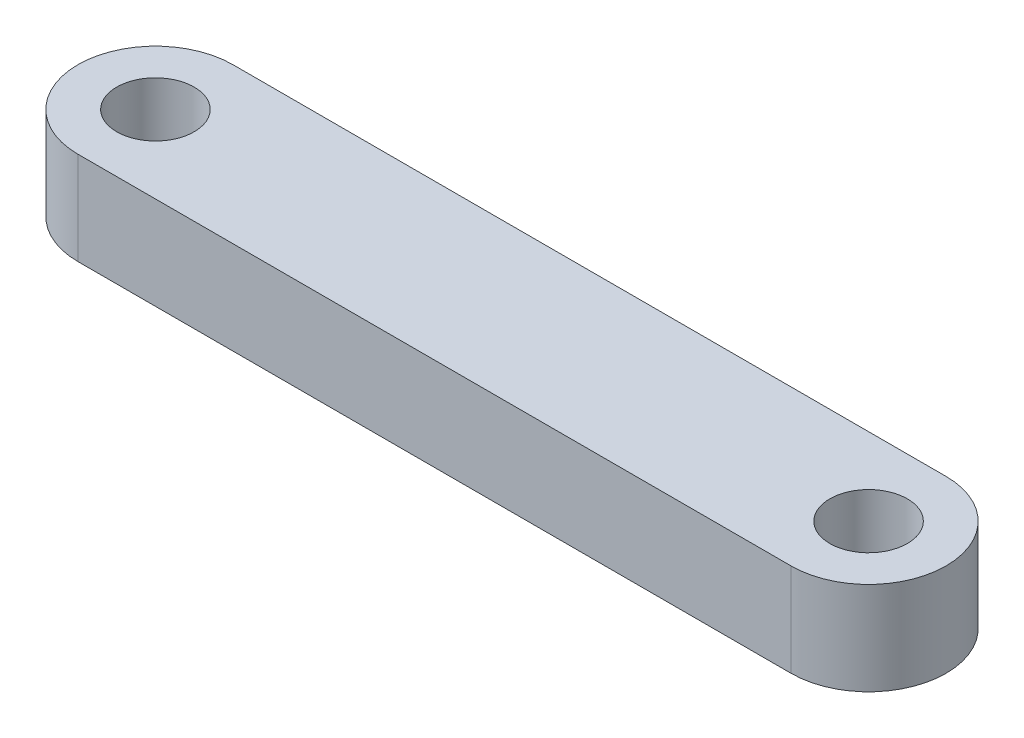
ISO-10303-21;
HEADER;
FILE_DESCRIPTION(('STEP AP214'),'2;1');
FILE_NAME('part.step','',(''),(''),'','','');
FILE_SCHEMA(('AUTOMOTIVE_DESIGN { 1 0 10303 214 1 1 1 1 }'));
ENDSEC;
DATA;
#1=APPLICATION_CONTEXT('core data for automotive mechanical design processes');
#2=APPLICATION_PROTOCOL_DEFINITION('international standard','automotive_design',2000,#1);
#3=PRODUCT_CONTEXT('',#1,'mechanical');
#4=PRODUCT('Part','Part','',(#3));
#5=PRODUCT_RELATED_PRODUCT_CATEGORY('part','',(#4));
#6=PRODUCT_DEFINITION_FORMATION('','',#4);
#7=PRODUCT_DEFINITION_CONTEXT('part definition',#1,'design');
#8=PRODUCT_DEFINITION('design','',#6,#7);
#9=PRODUCT_DEFINITION_SHAPE('','',#8);
#10=(LENGTH_UNIT() NAMED_UNIT(*) SI_UNIT(.MILLI.,.METRE.));
#11=(NAMED_UNIT(*) PLANE_ANGLE_UNIT() SI_UNIT($,.RADIAN.));
#12=(NAMED_UNIT(*) SI_UNIT($,.STERADIAN.) SOLID_ANGLE_UNIT());
#13=UNCERTAINTY_MEASURE_WITH_UNIT(LENGTH_MEASURE(1.E-05),#10,'distance_accuracy_value','');
#14=(GEOMETRIC_REPRESENTATION_CONTEXT(3) GLOBAL_UNCERTAINTY_ASSIGNED_CONTEXT((#13)) GLOBAL_UNIT_ASSIGNED_CONTEXT((#10,
#11,#12)) REPRESENTATION_CONTEXT('',''));
#15=CARTESIAN_POINT('',(0.,0.,0.));
#16=DIRECTION('',(0.,0.,1.));
#17=DIRECTION('',(1.,0.,0.));
#18=AXIS2_PLACEMENT_3D('',#15,#16,#17);
#19=CARTESIAN_POINT('',(11.5,3.,0.));
#20=DIRECTION('',(0.,-1.,0.));
#21=DIRECTION('',(0.,0.,-1.));
#22=AXIS2_PLACEMENT_3D('',#19,#20,#21);
#23=CYLINDRICAL_SURFACE('',#22,2.5);
#24=CARTESIAN_POINT('',(11.5,0.,0.));
#25=DIRECTION('',(0.,1.,0.));
#26=DIRECTION('',(0.,0.,1.));
#27=AXIS2_PLACEMENT_3D('',#24,#25,#26);
#28=CIRCLE('',#27,2.5);
#29=CARTESIAN_POINT('',(11.5,0.,2.49999999999999));
#30=VERTEX_POINT('',#29);
#31=CARTESIAN_POINT('',(11.5,0.,-2.50000000000001));
#32=VERTEX_POINT('',#31);
#33=EDGE_CURVE('E107',#30,#32,#28,.T.);
#34=ORIENTED_EDGE('',*,*,#33,.T.);
#35=DIRECTION('',(0.,-1.,0.));
#36=VECTOR('',#35,1.);
#37=CARTESIAN_POINT('',(11.5,3.,-2.50000000000001));
#38=LINE('',#37,#36);
#39=CARTESIAN_POINT('',(11.5,3.,-2.50000000000001));
#40=VERTEX_POINT('',#39);
#41=EDGE_CURVE('E11',#40,#32,#38,.T.);
#42=ORIENTED_EDGE('',*,*,#41,.F.);
#43=CARTESIAN_POINT('',(11.5,3.,0.));
#44=DIRECTION('',(0.,1.,0.));
#45=DIRECTION('',(0.,0.,1.));
#46=AXIS2_PLACEMENT_3D('',#43,#44,#45);
#47=CIRCLE('',#46,2.5);
#48=CARTESIAN_POINT('',(11.5,3.,2.49999999999999));
#49=VERTEX_POINT('',#48);
#50=EDGE_CURVE('E91',#49,#40,#47,.T.);
#51=ORIENTED_EDGE('',*,*,#50,.F.);
#52=DIRECTION('',(0.,-1.,0.));
#53=VECTOR('',#52,1.);
#54=CARTESIAN_POINT('',(11.5,3.,2.49999999999999));
#55=LINE('',#54,#53);
#56=EDGE_CURVE('E103',#49,#30,#55,.T.);
#57=ORIENTED_EDGE('',*,*,#56,.T.);
#58=EDGE_LOOP('',(#34,#42,#51,#57));
#59=FACE_BOUND('',#58,.T.);
#60=ADVANCED_FACE('F39',(#59),#23,.T.);
#61=CARTESIAN_POINT('',(11.5,3.,-2.50000000000001));
#62=DIRECTION('',(0.,0.,1.));
#63=DIRECTION('',(1.,0.,0.));
#64=AXIS2_PLACEMENT_3D('',#61,#62,#63);
#65=PLANE('',#64);
#66=DIRECTION('',(-1.,0.,0.));
#67=VECTOR('',#66,1.);
#68=CARTESIAN_POINT('',(11.5,0.,-2.50000000000001));
#69=LINE('',#68,#67);
#70=CARTESIAN_POINT('',(-11.5,0.,-2.5));
#71=VERTEX_POINT('',#70);
#72=EDGE_CURVE('E96',#32,#71,#69,.T.);
#73=ORIENTED_EDGE('',*,*,#72,.T.);
#74=DIRECTION('',(0.,-1.,0.));
#75=VECTOR('',#74,1.);
#76=CARTESIAN_POINT('',(-11.5,3.,-2.5));
#77=LINE('',#76,#75);
#78=CARTESIAN_POINT('',(-11.5,3.,-2.5));
#79=VERTEX_POINT('',#78);
#80=EDGE_CURVE('E48',#79,#71,#77,.T.);
#81=ORIENTED_EDGE('',*,*,#80,.F.);
#82=DIRECTION('',(-1.,0.,0.));
#83=VECTOR('',#82,1.);
#84=CARTESIAN_POINT('',(11.5,3.,-2.50000000000001));
#85=LINE('',#84,#83);
#86=EDGE_CURVE('E86',#40,#79,#85,.T.);
#87=ORIENTED_EDGE('',*,*,#86,.F.);
#88=ORIENTED_EDGE('',*,*,#41,.T.);
#89=EDGE_LOOP('',(#73,#81,#87,#88));
#90=FACE_BOUND('',#89,.T.);
#91=ADVANCED_FACE('F95',(#90),#65,.F.);
#92=CARTESIAN_POINT('',(-11.5,3.,0.));
#93=DIRECTION('',(0.,-1.,0.));
#94=DIRECTION('',(0.,0.,-1.));
#95=AXIS2_PLACEMENT_3D('',#92,#93,#94);
#96=CYLINDRICAL_SURFACE('',#95,2.5);
#97=CARTESIAN_POINT('',(-11.5,0.,0.));
#98=DIRECTION('',(0.,1.,0.));
#99=DIRECTION('',(0.,0.,1.));
#100=AXIS2_PLACEMENT_3D('',#97,#98,#99);
#101=CIRCLE('',#100,2.5);
#102=CARTESIAN_POINT('',(-11.5,0.,2.5));
#103=VERTEX_POINT('',#102);
#104=EDGE_CURVE('E73',#71,#103,#101,.T.);
#105=ORIENTED_EDGE('',*,*,#104,.T.);
#106=DIRECTION('',(0.,-1.,0.));
#107=VECTOR('',#106,1.);
#108=CARTESIAN_POINT('',(-11.5,3.,2.5));
#109=LINE('',#108,#107);
#110=CARTESIAN_POINT('',(-11.5,3.,2.5));
#111=VERTEX_POINT('',#110);
#112=EDGE_CURVE('E98',#111,#103,#109,.T.);
#113=ORIENTED_EDGE('',*,*,#112,.F.);
#114=CARTESIAN_POINT('',(-11.5,3.,0.));
#115=DIRECTION('',(0.,1.,0.));
#116=DIRECTION('',(0.,0.,1.));
#117=AXIS2_PLACEMENT_3D('',#114,#115,#116);
#118=CIRCLE('',#117,2.5);
#119=EDGE_CURVE('E89',#79,#111,#118,.T.);
#120=ORIENTED_EDGE('',*,*,#119,.F.);
#121=ORIENTED_EDGE('',*,*,#80,.T.);
#122=EDGE_LOOP('',(#105,#113,#120,#121));
#123=FACE_BOUND('',#122,.T.);
#124=ADVANCED_FACE('F99',(#123),#96,.T.);
#125=CARTESIAN_POINT('',(11.5,3.,2.49999999999999));
#126=DIRECTION('',(0.,0.,-1.));
#127=DIRECTION('',(-1.,0.,0.));
#128=AXIS2_PLACEMENT_3D('',#125,#126,#127);
#129=PLANE('',#128);
#130=DIRECTION('',(1.,0.,0.));
#131=VECTOR('',#130,1.);
#132=CARTESIAN_POINT('',(11.5,0.,2.49999999999999));
#133=LINE('',#132,#131);
#134=EDGE_CURVE('E79',#103,#30,#133,.T.);
#135=ORIENTED_EDGE('',*,*,#134,.T.);
#136=ORIENTED_EDGE('',*,*,#56,.F.);
#137=DIRECTION('',(1.,0.,0.));
#138=VECTOR('',#137,1.);
#139=CARTESIAN_POINT('',(11.5,3.,2.49999999999999));
#140=LINE('',#139,#138);
#141=EDGE_CURVE('E56',#111,#49,#140,.T.);
#142=ORIENTED_EDGE('',*,*,#141,.F.);
#143=ORIENTED_EDGE('',*,*,#112,.T.);
#144=EDGE_LOOP('',(#135,#136,#142,#143));
#145=FACE_BOUND('',#144,.T.);
#146=ADVANCED_FACE('F121',(#145),#129,.F.);
#147=CARTESIAN_POINT('',(11.5,3.,0.));
#148=DIRECTION('',(0.,1.,0.));
#149=DIRECTION('',(0.,0.,1.));
#150=AXIS2_PLACEMENT_3D('',#147,#148,#149);
#151=PLANE('',#150);
#152=CARTESIAN_POINT('',(-11.5,3.,0.));
#153=DIRECTION('',(0.,1.,0.));
#154=DIRECTION('',(0.,0.,1.));
#155=AXIS2_PLACEMENT_3D('',#152,#153,#154);
#156=CIRCLE('',#155,1.25);
#157=CARTESIAN_POINT('',(-11.5,3.,1.25));
#158=VERTEX_POINT('',#157);
#159=EDGE_CURVE('E136',#158,#158,#156,.T.);
#160=ORIENTED_EDGE('',*,*,#159,.F.);
#161=EDGE_LOOP('',(#160));
#162=FACE_BOUND('',#161,.T.);
#163=CARTESIAN_POINT('',(11.5,3.,0.));
#164=DIRECTION('',(0.,1.,0.));
#165=DIRECTION('',(0.,0.,1.));
#166=AXIS2_PLACEMENT_3D('',#163,#164,#165);
#167=CIRCLE('',#166,1.25);
#168=CARTESIAN_POINT('',(11.5,3.,1.25));
#169=VERTEX_POINT('',#168);
#170=EDGE_CURVE('E128',#169,#169,#167,.T.);
#171=ORIENTED_EDGE('',*,*,#170,.F.);
#172=EDGE_LOOP('',(#171));
#173=FACE_BOUND('',#172,.T.);
#174=ORIENTED_EDGE('',*,*,#50,.T.);
#175=ORIENTED_EDGE('',*,*,#86,.T.);
#176=ORIENTED_EDGE('',*,*,#119,.T.);
#177=ORIENTED_EDGE('',*,*,#141,.T.);
#178=EDGE_LOOP('',(#174,#175,#176,#177));
#179=FACE_BOUND('',#178,.T.);
#180=ADVANCED_FACE('F87',(#162,#173,#179),#151,.T.);
#181=CARTESIAN_POINT('',(11.5,0.,0.));
#182=DIRECTION('',(0.,1.,0.));
#183=DIRECTION('',(0.,0.,1.));
#184=AXIS2_PLACEMENT_3D('',#181,#182,#183);
#185=PLANE('',#184);
#186=CARTESIAN_POINT('',(-11.5,0.,0.));
#187=DIRECTION('',(0.,1.,0.));
#188=DIRECTION('',(0.,0.,1.));
#189=AXIS2_PLACEMENT_3D('',#186,#187,#188);
#190=CIRCLE('',#189,1.25);
#191=CARTESIAN_POINT('',(-11.5,0.,1.25));
#192=VERTEX_POINT('',#191);
#193=EDGE_CURVE('E132',#192,#192,#190,.T.);
#194=ORIENTED_EDGE('',*,*,#193,.T.);
#195=EDGE_LOOP('',(#194));
#196=FACE_BOUND('',#195,.T.);
#197=CARTESIAN_POINT('',(11.5,0.,0.));
#198=DIRECTION('',(0.,1.,0.));
#199=DIRECTION('',(0.,0.,1.));
#200=AXIS2_PLACEMENT_3D('',#197,#198,#199);
#201=CIRCLE('',#200,1.25);
#202=CARTESIAN_POINT('',(11.5,0.,1.25));
#203=VERTEX_POINT('',#202);
#204=EDGE_CURVE('E111',#203,#203,#201,.T.);
#205=ORIENTED_EDGE('',*,*,#204,.T.);
#206=EDGE_LOOP('',(#205));
#207=FACE_BOUND('',#206,.T.);
#208=ORIENTED_EDGE('',*,*,#33,.F.);
#209=ORIENTED_EDGE('',*,*,#134,.F.);
#210=ORIENTED_EDGE('',*,*,#104,.F.);
#211=ORIENTED_EDGE('',*,*,#72,.F.);
#212=EDGE_LOOP('',(#208,#209,#210,#211));
#213=FACE_BOUND('',#212,.T.);
#214=ADVANCED_FACE('F124',(#196,#207,#213),#185,.F.);
#215=CARTESIAN_POINT('',(11.5,0.,0.));
#216=DIRECTION('',(0.,1.,0.));
#217=DIRECTION('',(0.,0.,1.));
#218=AXIS2_PLACEMENT_3D('',#215,#216,#217);
#219=CYLINDRICAL_SURFACE('',#218,1.25);
#220=ORIENTED_EDGE('',*,*,#204,.F.);
#221=EDGE_LOOP('',(#220));
#222=FACE_BOUND('',#221,.T.);
#223=ORIENTED_EDGE('',*,*,#170,.T.);
#224=EDGE_LOOP('',(#223));
#225=FACE_BOUND('',#224,.T.);
#226=ADVANCED_FACE('F149',(#222,#225),#219,.F.);
#227=CARTESIAN_POINT('',(-11.5,0.,0.));
#228=DIRECTION('',(0.,1.,0.));
#229=DIRECTION('',(0.,0.,1.));
#230=AXIS2_PLACEMENT_3D('',#227,#228,#229);
#231=CYLINDRICAL_SURFACE('',#230,1.25);
#232=ORIENTED_EDGE('',*,*,#193,.F.);
#233=EDGE_LOOP('',(#232));
#234=FACE_BOUND('',#233,.T.);
#235=ORIENTED_EDGE('',*,*,#159,.T.);
#236=EDGE_LOOP('',(#235));
#237=FACE_BOUND('',#236,.T.);
#238=ADVANCED_FACE('F146',(#234,#237),#231,.F.);
#239=CLOSED_SHELL('',(#60,#91,#124,#146,#180,#214,#226,#238));
#240=MANIFOLD_SOLID_BREP('B2',#239);
#241=ADVANCED_BREP_SHAPE_REPRESENTATION('',(#18,#240),#14);
#242=SHAPE_DEFINITION_REPRESENTATION(#9,#241);
ENDSEC;
END-ISO-10303-21;
